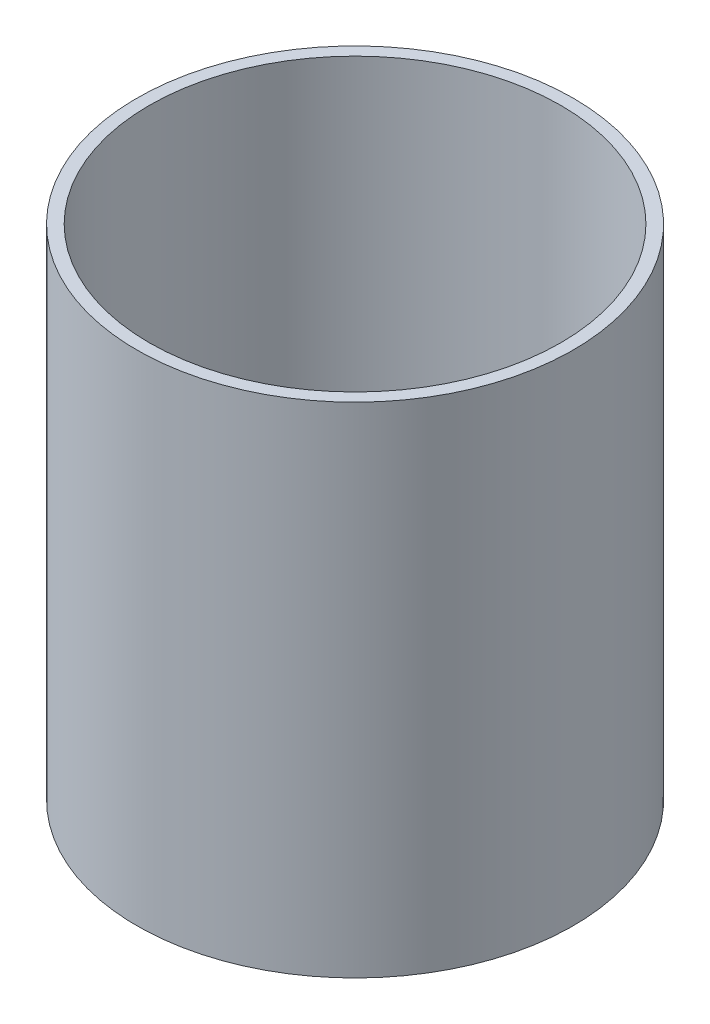
ISO-10303-21;
HEADER;
FILE_DESCRIPTION(('STEP AP214'),'2;1');
FILE_NAME('part.step','',(''),(''),'','','');
FILE_SCHEMA(('AUTOMOTIVE_DESIGN { 1 0 10303 214 1 1 1 1 }'));
ENDSEC;
DATA;
#1=APPLICATION_CONTEXT('core data for automotive mechanical design processes');
#2=APPLICATION_PROTOCOL_DEFINITION('international standard','automotive_design',2000,#1);
#3=PRODUCT_CONTEXT('',#1,'mechanical');
#4=PRODUCT('Part','Part','',(#3));
#5=PRODUCT_RELATED_PRODUCT_CATEGORY('part','',(#4));
#6=PRODUCT_DEFINITION_FORMATION('','',#4);
#7=PRODUCT_DEFINITION_CONTEXT('part definition',#1,'design');
#8=PRODUCT_DEFINITION('design','',#6,#7);
#9=PRODUCT_DEFINITION_SHAPE('','',#8);
#10=(LENGTH_UNIT() NAMED_UNIT(*) SI_UNIT(.MILLI.,.METRE.));
#11=(NAMED_UNIT(*) PLANE_ANGLE_UNIT() SI_UNIT($,.RADIAN.));
#12=(NAMED_UNIT(*) SI_UNIT($,.STERADIAN.) SOLID_ANGLE_UNIT());
#13=UNCERTAINTY_MEASURE_WITH_UNIT(LENGTH_MEASURE(1.E-05),#10,'distance_accuracy_value','');
#14=(GEOMETRIC_REPRESENTATION_CONTEXT(3) GLOBAL_UNCERTAINTY_ASSIGNED_CONTEXT((#13)) GLOBAL_UNIT_ASSIGNED_CONTEXT((#10,
#11,#12)) REPRESENTATION_CONTEXT('',''));
#15=CARTESIAN_POINT('',(0.,0.,0.));
#16=DIRECTION('',(0.,0.,1.));
#17=DIRECTION('',(1.,0.,0.));
#18=AXIS2_PLACEMENT_3D('',#15,#16,#17);
#19=CARTESIAN_POINT('',(0.,-209.123134328358,0.));
#20=DIRECTION('',(0.,-1.,0.));
#21=DIRECTION('',(0.,0.,-1.));
#22=AXIS2_PLACEMENT_3D('',#19,#20,#21);
#23=PLANE('',#22);
#24=CARTESIAN_POINT('',(0.,-209.123134328358,0.));
#25=DIRECTION('',(0.,-1.,0.));
#26=DIRECTION('',(0.,0.,-1.));
#27=AXIS2_PLACEMENT_3D('',#24,#25,#26);
#28=CIRCLE('',#27,165.);
#29=CARTESIAN_POINT('',(0.,-209.123134328358,-165.));
#30=VERTEX_POINT('',#29);
#31=EDGE_CURVE('E10',#30,#30,#28,.T.);
#32=ORIENTED_EDGE('',*,*,#31,.F.);
#33=EDGE_LOOP('',(#32));
#34=FACE_BOUND('',#33,.T.);
#35=ADVANCED_FACE('F31',(#34),#23,.F.);
#36=CARTESIAN_POINT('',(0.,-219.123134328358,0.));
#37=DIRECTION('',(0.,-1.,0.));
#38=DIRECTION('',(0.,0.,-1.));
#39=AXIS2_PLACEMENT_3D('',#36,#37,#38);
#40=CYLINDRICAL_SURFACE('',#39,165.);
#41=CARTESIAN_POINT('',(0.,180.876865671642,0.));
#42=DIRECTION('',(0.,-1.,0.));
#43=DIRECTION('',(0.,0.,-1.));
#44=AXIS2_PLACEMENT_3D('',#41,#42,#43);
#45=CIRCLE('',#44,165.);
#46=CARTESIAN_POINT('',(0.,180.876865671642,-165.));
#47=VERTEX_POINT('',#46);
#48=EDGE_CURVE('E37',#47,#47,#45,.T.);
#49=ORIENTED_EDGE('',*,*,#48,.F.);
#50=EDGE_LOOP('',(#49));
#51=FACE_BOUND('',#50,.T.);
#52=ORIENTED_EDGE('',*,*,#31,.T.);
#53=EDGE_LOOP('',(#52));
#54=FACE_BOUND('',#53,.T.);
#55=ADVANCED_FACE('F61',(#51,#54),#40,.F.);
#56=CARTESIAN_POINT('',(0.,180.876865671642,165.));
#57=DIRECTION('',(0.,-1.,0.));
#58=DIRECTION('',(0.,0.,-1.));
#59=AXIS2_PLACEMENT_3D('',#56,#57,#58);
#60=PLANE('',#59);
#61=CARTESIAN_POINT('',(0.,180.876865671642,0.));
#62=DIRECTION('',(0.,-1.,0.));
#63=DIRECTION('',(0.,0.,-1.));
#64=AXIS2_PLACEMENT_3D('',#61,#62,#63);
#65=CIRCLE('',#64,175.);
#66=CARTESIAN_POINT('',(0.,180.876865671642,-175.));
#67=VERTEX_POINT('',#66);
#68=EDGE_CURVE('E41',#67,#67,#65,.T.);
#69=ORIENTED_EDGE('',*,*,#68,.F.);
#70=EDGE_LOOP('',(#69));
#71=FACE_BOUND('',#70,.T.);
#72=ORIENTED_EDGE('',*,*,#48,.T.);
#73=EDGE_LOOP('',(#72));
#74=FACE_BOUND('',#73,.T.);
#75=ADVANCED_FACE('F56',(#71,#74),#60,.F.);
#76=CARTESIAN_POINT('',(0.,-219.123134328358,0.));
#77=DIRECTION('',(0.,-1.,0.));
#78=DIRECTION('',(0.,0.,-1.));
#79=AXIS2_PLACEMENT_3D('',#76,#77,#78);
#80=CYLINDRICAL_SURFACE('',#79,175.);
#81=CARTESIAN_POINT('',(0.,-219.123134328358,0.));
#82=DIRECTION('',(0.,-1.,0.));
#83=DIRECTION('',(0.,0.,-1.));
#84=AXIS2_PLACEMENT_3D('',#81,#82,#83);
#85=CIRCLE('',#84,175.);
#86=CARTESIAN_POINT('',(0.,-219.123134328358,-175.));
#87=VERTEX_POINT('',#86);
#88=EDGE_CURVE('E45',#87,#87,#85,.T.);
#89=ORIENTED_EDGE('',*,*,#88,.F.);
#90=EDGE_LOOP('',(#89));
#91=FACE_BOUND('',#90,.T.);
#92=ORIENTED_EDGE('',*,*,#68,.T.);
#93=EDGE_LOOP('',(#92));
#94=FACE_BOUND('',#93,.T.);
#95=ADVANCED_FACE('F53',(#91,#94),#80,.T.);
#96=CARTESIAN_POINT('',(0.,-219.123134328358,175.));
#97=DIRECTION('',(0.,1.,0.));
#98=DIRECTION('',(0.,0.,1.));
#99=AXIS2_PLACEMENT_3D('',#96,#97,#98);
#100=PLANE('',#99);
#101=ORIENTED_EDGE('',*,*,#88,.T.);
#102=EDGE_LOOP('',(#101));
#103=FACE_BOUND('',#102,.T.);
#104=ADVANCED_FACE('F51',(#103),#100,.F.);
#105=CLOSED_SHELL('',(#35,#55,#75,#95,#104));
#106=MANIFOLD_SOLID_BREP('B2',#105);
#107=ADVANCED_BREP_SHAPE_REPRESENTATION('',(#18,#106),#14);
#108=SHAPE_DEFINITION_REPRESENTATION(#9,#107);
ENDSEC;
END-ISO-10303-21;
